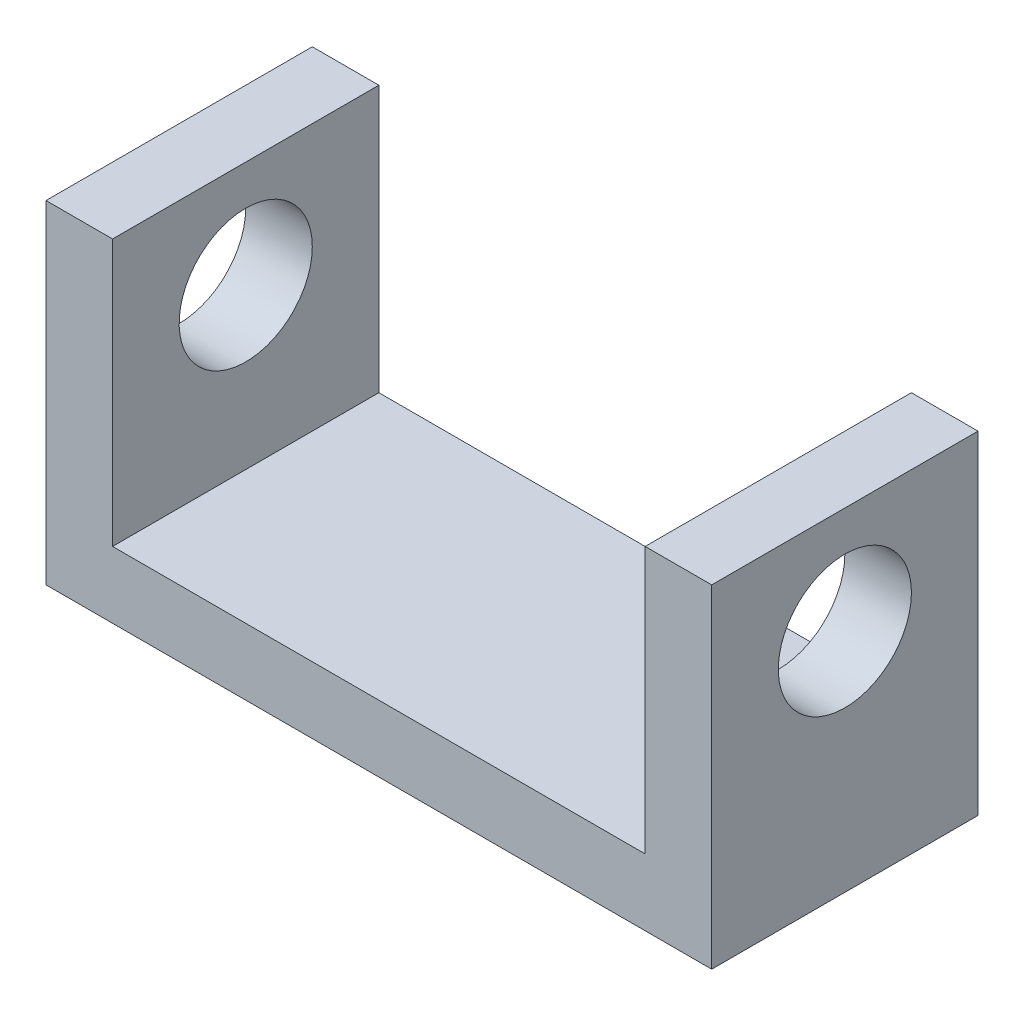
ISO-10303-21;
HEADER;
FILE_DESCRIPTION(('STEP AP214'),'2;1');
FILE_NAME('part.step','',(''),(''),'','','');
FILE_SCHEMA(('AUTOMOTIVE_DESIGN { 1 0 10303 214 1 1 1 1 }'));
ENDSEC;
DATA;
#1=APPLICATION_CONTEXT('core data for automotive mechanical design processes');
#2=APPLICATION_PROTOCOL_DEFINITION('international standard','automotive_design',2000,#1);
#3=PRODUCT_CONTEXT('',#1,'mechanical');
#4=PRODUCT('Part','Part','',(#3));
#5=PRODUCT_RELATED_PRODUCT_CATEGORY('part','',(#4));
#6=PRODUCT_DEFINITION_FORMATION('','',#4);
#7=PRODUCT_DEFINITION_CONTEXT('part definition',#1,'design');
#8=PRODUCT_DEFINITION('design','',#6,#7);
#9=PRODUCT_DEFINITION_SHAPE('','',#8);
#10=(LENGTH_UNIT() NAMED_UNIT(*) SI_UNIT(.MILLI.,.METRE.));
#11=(NAMED_UNIT(*) PLANE_ANGLE_UNIT() SI_UNIT($,.RADIAN.));
#12=(NAMED_UNIT(*) SI_UNIT($,.STERADIAN.) SOLID_ANGLE_UNIT());
#13=UNCERTAINTY_MEASURE_WITH_UNIT(LENGTH_MEASURE(1.E-05),#10,'distance_accuracy_value','');
#14=(GEOMETRIC_REPRESENTATION_CONTEXT(3) GLOBAL_UNCERTAINTY_ASSIGNED_CONTEXT((#13)) GLOBAL_UNIT_ASSIGNED_CONTEXT((#10,
#11,#12)) REPRESENTATION_CONTEXT('',''));
#15=CARTESIAN_POINT('',(0.,0.,0.));
#16=DIRECTION('',(0.,0.,1.));
#17=DIRECTION('',(1.,0.,0.));
#18=AXIS2_PLACEMENT_3D('',#15,#16,#17);
#19=CARTESIAN_POINT('',(28.575,0.,12.7));
#20=DIRECTION('',(-1.,0.,0.));
#21=DIRECTION('',(0.,0.,1.));
#22=AXIS2_PLACEMENT_3D('',#19,#20,#21);
#23=PLANE('',#22);
#24=CARTESIAN_POINT('',(28.575,7.62,6.35));
#25=DIRECTION('',(1.,0.,0.));
#26=DIRECTION('',(0.,0.,-1.));
#27=AXIS2_PLACEMENT_3D('',#24,#25,#26);
#28=CIRCLE('',#27,3.175);
#29=CARTESIAN_POINT('',(28.575,7.62,3.175));
#30=VERTEX_POINT('',#29);
#31=EDGE_CURVE('E188',#30,#30,#28,.T.);
#32=ORIENTED_EDGE('',*,*,#31,.F.);
#33=EDGE_LOOP('',(#32));
#34=FACE_BOUND('',#33,.T.);
#35=DIRECTION('',(0.,1.,0.));
#36=VECTOR('',#35,1.);
#37=CARTESIAN_POINT('',(28.575,0.,0.));
#38=LINE('',#37,#36);
#39=CARTESIAN_POINT('',(28.575,-3.175,0.));
#40=VERTEX_POINT('',#39);
#41=CARTESIAN_POINT('',(28.575,12.7,0.));
#42=VERTEX_POINT('',#41);
#43=EDGE_CURVE('E134',#40,#42,#38,.T.);
#44=ORIENTED_EDGE('',*,*,#43,.T.);
#45=DIRECTION('',(0.,0.,-1.));
#46=VECTOR('',#45,1.);
#47=CARTESIAN_POINT('',(28.575,12.7,12.7));
#48=LINE('',#47,#46);
#49=CARTESIAN_POINT('',(28.575,12.7,12.7));
#50=VERTEX_POINT('',#49);
#51=EDGE_CURVE('E11',#50,#42,#48,.T.);
#52=ORIENTED_EDGE('',*,*,#51,.F.);
#53=DIRECTION('',(0.,1.,0.));
#54=VECTOR('',#53,1.);
#55=CARTESIAN_POINT('',(28.575,0.,12.7));
#56=LINE('',#55,#54);
#57=CARTESIAN_POINT('',(28.575,-3.175,12.7));
#58=VERTEX_POINT('',#57);
#59=EDGE_CURVE('E92',#58,#50,#56,.T.);
#60=ORIENTED_EDGE('',*,*,#59,.F.);
#61=DIRECTION('',(0.,0.,-1.));
#62=VECTOR('',#61,1.);
#63=CARTESIAN_POINT('',(28.575,-3.175,12.7));
#64=LINE('',#63,#62);
#65=EDGE_CURVE('E133',#58,#40,#64,.T.);
#66=ORIENTED_EDGE('',*,*,#65,.T.);
#67=EDGE_LOOP('',(#44,#52,#60,#66));
#68=FACE_BOUND('',#67,.T.);
#69=ADVANCED_FACE('F37',(#34,#68),#23,.F.);
#70=CARTESIAN_POINT('',(25.4,12.7,12.7));
#71=DIRECTION('',(0.,1.,0.));
#72=DIRECTION('',(0.,0.,1.));
#73=AXIS2_PLACEMENT_3D('',#70,#71,#72);
#74=PLANE('',#73);
#75=DIRECTION('',(1.,0.,0.));
#76=VECTOR('',#75,1.);
#77=CARTESIAN_POINT('',(25.4,12.7,0.));
#78=LINE('',#77,#76);
#79=CARTESIAN_POINT('',(25.4,12.7,0.));
#80=VERTEX_POINT('',#79);
#81=EDGE_CURVE('E137',#80,#42,#78,.T.);
#82=ORIENTED_EDGE('',*,*,#81,.F.);
#83=DIRECTION('',(0.,0.,-1.));
#84=VECTOR('',#83,1.);
#85=CARTESIAN_POINT('',(25.4,12.7,12.7));
#86=LINE('',#85,#84);
#87=CARTESIAN_POINT('',(25.4,12.7,12.7));
#88=VERTEX_POINT('',#87);
#89=EDGE_CURVE('E45',#88,#80,#86,.T.);
#90=ORIENTED_EDGE('',*,*,#89,.F.);
#91=DIRECTION('',(1.,0.,0.));
#92=VECTOR('',#91,1.);
#93=CARTESIAN_POINT('',(25.4,12.7,12.7));
#94=LINE('',#93,#92);
#95=EDGE_CURVE('E177',#88,#50,#94,.T.);
#96=ORIENTED_EDGE('',*,*,#95,.T.);
#97=ORIENTED_EDGE('',*,*,#51,.T.);
#98=EDGE_LOOP('',(#82,#90,#96,#97));
#99=FACE_BOUND('',#98,.T.);
#100=ADVANCED_FACE('F168',(#99),#74,.T.);
#101=CARTESIAN_POINT('',(25.4,0.,12.7));
#102=DIRECTION('',(-1.,0.,0.));
#103=DIRECTION('',(0.,0.,1.));
#104=AXIS2_PLACEMENT_3D('',#101,#102,#103);
#105=PLANE('',#104);
#106=CARTESIAN_POINT('',(25.4,7.62,6.35));
#107=DIRECTION('',(-1.,0.,0.));
#108=DIRECTION('',(0.,0.,1.));
#109=AXIS2_PLACEMENT_3D('',#106,#107,#108);
#110=CIRCLE('',#109,3.175);
#111=CARTESIAN_POINT('',(25.4,7.62,9.525));
#112=VERTEX_POINT('',#111);
#113=EDGE_CURVE('E138',#112,#112,#110,.T.);
#114=ORIENTED_EDGE('',*,*,#113,.F.);
#115=EDGE_LOOP('',(#114));
#116=FACE_BOUND('',#115,.T.);
#117=DIRECTION('',(0.,1.,0.));
#118=VECTOR('',#117,1.);
#119=CARTESIAN_POINT('',(25.4,0.,0.));
#120=LINE('',#119,#118);
#121=CARTESIAN_POINT('',(25.4,0.,0.));
#122=VERTEX_POINT('',#121);
#123=EDGE_CURVE('E141',#122,#80,#120,.T.);
#124=ORIENTED_EDGE('',*,*,#123,.F.);
#125=DIRECTION('',(0.,0.,-1.));
#126=VECTOR('',#125,1.);
#127=CARTESIAN_POINT('',(25.4,0.,12.7));
#128=LINE('',#127,#126);
#129=CARTESIAN_POINT('',(25.4,0.,12.7));
#130=VERTEX_POINT('',#129);
#131=EDGE_CURVE('E158',#130,#122,#128,.T.);
#132=ORIENTED_EDGE('',*,*,#131,.F.);
#133=DIRECTION('',(0.,1.,0.));
#134=VECTOR('',#133,1.);
#135=CARTESIAN_POINT('',(25.4,0.,12.7));
#136=LINE('',#135,#134);
#137=EDGE_CURVE('E165',#130,#88,#136,.T.);
#138=ORIENTED_EDGE('',*,*,#137,.T.);
#139=ORIENTED_EDGE('',*,*,#89,.T.);
#140=EDGE_LOOP('',(#124,#132,#138,#139));
#141=FACE_BOUND('',#140,.T.);
#142=ADVANCED_FACE('F163',(#116,#141),#105,.T.);
#143=CARTESIAN_POINT('',(0.,0.,12.7));
#144=DIRECTION('',(0.,1.,0.));
#145=DIRECTION('',(0.,0.,1.));
#146=AXIS2_PLACEMENT_3D('',#143,#144,#145);
#147=PLANE('',#146);
#148=DIRECTION('',(1.,0.,0.));
#149=VECTOR('',#148,1.);
#150=CARTESIAN_POINT('',(0.,0.,0.));
#151=LINE('',#150,#149);
#152=CARTESIAN_POINT('',(0.,0.,0.));
#153=VERTEX_POINT('',#152);
#154=EDGE_CURVE('E144',#153,#122,#151,.T.);
#155=ORIENTED_EDGE('',*,*,#154,.F.);
#156=DIRECTION('',(0.,0.,-1.));
#157=VECTOR('',#156,1.);
#158=CARTESIAN_POINT('',(0.,0.,12.7));
#159=LINE('',#158,#157);
#160=CARTESIAN_POINT('',(0.,0.,12.7));
#161=VERTEX_POINT('',#160);
#162=EDGE_CURVE('E156',#161,#153,#159,.T.);
#163=ORIENTED_EDGE('',*,*,#162,.F.);
#164=DIRECTION('',(1.,0.,0.));
#165=VECTOR('',#164,1.);
#166=CARTESIAN_POINT('',(0.,0.,12.7));
#167=LINE('',#166,#165);
#168=EDGE_CURVE('E128',#161,#130,#167,.T.);
#169=ORIENTED_EDGE('',*,*,#168,.T.);
#170=ORIENTED_EDGE('',*,*,#131,.T.);
#171=EDGE_LOOP('',(#155,#163,#169,#170));
#172=FACE_BOUND('',#171,.T.);
#173=ADVANCED_FACE('F175',(#172),#147,.T.);
#174=CARTESIAN_POINT('',(0.,12.7,12.7));
#175=DIRECTION('',(1.,0.,0.));
#176=DIRECTION('',(0.,1.,0.));
#177=AXIS2_PLACEMENT_3D('',#174,#175,#176);
#178=PLANE('',#177);
#179=CARTESIAN_POINT('',(0.,7.62,6.35));
#180=DIRECTION('',(1.,0.,0.));
#181=DIRECTION('',(0.,1.,0.));
#182=AXIS2_PLACEMENT_3D('',#179,#180,#181);
#183=CIRCLE('',#182,3.175);
#184=CARTESIAN_POINT('',(0.,10.795,6.35));
#185=VERTEX_POINT('',#184);
#186=EDGE_CURVE('E184',#185,#185,#183,.T.);
#187=ORIENTED_EDGE('',*,*,#186,.F.);
#188=EDGE_LOOP('',(#187));
#189=FACE_BOUND('',#188,.T.);
#190=DIRECTION('',(0.,-1.,0.));
#191=VECTOR('',#190,1.);
#192=CARTESIAN_POINT('',(0.,12.7,0.));
#193=LINE('',#192,#191);
#194=CARTESIAN_POINT('',(0.,12.7,0.));
#195=VERTEX_POINT('',#194);
#196=EDGE_CURVE('E147',#195,#153,#193,.T.);
#197=ORIENTED_EDGE('',*,*,#196,.F.);
#198=DIRECTION('',(0.,0.,-1.));
#199=VECTOR('',#198,1.);
#200=CARTESIAN_POINT('',(0.,12.7,12.7));
#201=LINE('',#200,#199);
#202=CARTESIAN_POINT('',(0.,12.7,12.7));
#203=VERTEX_POINT('',#202);
#204=EDGE_CURVE('E116',#203,#195,#201,.T.);
#205=ORIENTED_EDGE('',*,*,#204,.F.);
#206=DIRECTION('',(0.,-1.,0.));
#207=VECTOR('',#206,1.);
#208=CARTESIAN_POINT('',(0.,12.7,12.7));
#209=LINE('',#208,#207);
#210=EDGE_CURVE('E126',#203,#161,#209,.T.);
#211=ORIENTED_EDGE('',*,*,#210,.T.);
#212=ORIENTED_EDGE('',*,*,#162,.T.);
#213=EDGE_LOOP('',(#197,#205,#211,#212));
#214=FACE_BOUND('',#213,.T.);
#215=ADVANCED_FACE('F228',(#189,#214),#178,.T.);
#216=CARTESIAN_POINT('',(-3.175,12.7,12.7));
#217=DIRECTION('',(0.,1.,0.));
#218=DIRECTION('',(0.,0.,1.));
#219=AXIS2_PLACEMENT_3D('',#216,#217,#218);
#220=PLANE('',#219);
#221=DIRECTION('',(1.,0.,0.));
#222=VECTOR('',#221,1.);
#223=CARTESIAN_POINT('',(-3.175,12.7,0.));
#224=LINE('',#223,#222);
#225=CARTESIAN_POINT('',(-3.175,12.7,0.));
#226=VERTEX_POINT('',#225);
#227=EDGE_CURVE('E115',#226,#195,#224,.T.);
#228=ORIENTED_EDGE('',*,*,#227,.F.);
#229=DIRECTION('',(0.,0.,-1.));
#230=VECTOR('',#229,1.);
#231=CARTESIAN_POINT('',(-3.175,12.7,12.7));
#232=LINE('',#231,#230);
#233=CARTESIAN_POINT('',(-3.175,12.7,12.7));
#234=VERTEX_POINT('',#233);
#235=EDGE_CURVE('E109',#234,#226,#232,.T.);
#236=ORIENTED_EDGE('',*,*,#235,.F.);
#237=DIRECTION('',(1.,0.,0.));
#238=VECTOR('',#237,1.);
#239=CARTESIAN_POINT('',(-3.175,12.7,12.7));
#240=LINE('',#239,#238);
#241=EDGE_CURVE('E113',#234,#203,#240,.T.);
#242=ORIENTED_EDGE('',*,*,#241,.T.);
#243=ORIENTED_EDGE('',*,*,#204,.T.);
#244=EDGE_LOOP('',(#228,#236,#242,#243));
#245=FACE_BOUND('',#244,.T.);
#246=ADVANCED_FACE('F111',(#245),#220,.T.);
#247=CARTESIAN_POINT('',(-3.175,12.7,12.7));
#248=DIRECTION('',(1.,0.,0.));
#249=DIRECTION('',(0.,1.,0.));
#250=AXIS2_PLACEMENT_3D('',#247,#248,#249);
#251=PLANE('',#250);
#252=CARTESIAN_POINT('',(-3.175,7.62,6.35));
#253=DIRECTION('',(1.,0.,0.));
#254=DIRECTION('',(0.,0.,-1.));
#255=AXIS2_PLACEMENT_3D('',#252,#253,#254);
#256=CIRCLE('',#255,3.175);
#257=CARTESIAN_POINT('',(-3.175,7.62,3.175));
#258=VERTEX_POINT('',#257);
#259=EDGE_CURVE('E187',#258,#258,#256,.T.);
#260=ORIENTED_EDGE('',*,*,#259,.T.);
#261=EDGE_LOOP('',(#260));
#262=FACE_BOUND('',#261,.T.);
#263=DIRECTION('',(0.,-1.,0.));
#264=VECTOR('',#263,1.);
#265=CARTESIAN_POINT('',(-3.175,12.7,0.));
#266=LINE('',#265,#264);
#267=CARTESIAN_POINT('',(-3.175,-3.175,0.));
#268=VERTEX_POINT('',#267);
#269=EDGE_CURVE('E80',#226,#268,#266,.T.);
#270=ORIENTED_EDGE('',*,*,#269,.T.);
#271=DIRECTION('',(0.,0.,-1.));
#272=VECTOR('',#271,1.);
#273=CARTESIAN_POINT('',(-3.175,-3.175,12.7));
#274=LINE('',#273,#272);
#275=CARTESIAN_POINT('',(-3.175,-3.175,12.7));
#276=VERTEX_POINT('',#275);
#277=EDGE_CURVE('E117',#276,#268,#274,.T.);
#278=ORIENTED_EDGE('',*,*,#277,.F.);
#279=DIRECTION('',(0.,-1.,0.));
#280=VECTOR('',#279,1.);
#281=CARTESIAN_POINT('',(-3.175,12.7,12.7));
#282=LINE('',#281,#280);
#283=EDGE_CURVE('E119',#234,#276,#282,.T.);
#284=ORIENTED_EDGE('',*,*,#283,.F.);
#285=ORIENTED_EDGE('',*,*,#235,.T.);
#286=EDGE_LOOP('',(#270,#278,#284,#285));
#287=FACE_BOUND('',#286,.T.);
#288=ADVANCED_FACE('F120',(#262,#287),#251,.F.);
#289=CARTESIAN_POINT('',(0.,-3.175,12.7));
#290=DIRECTION('',(0.,1.,0.));
#291=DIRECTION('',(0.,0.,1.));
#292=AXIS2_PLACEMENT_3D('',#289,#290,#291);
#293=PLANE('',#292);
#294=DIRECTION('',(1.,0.,0.));
#295=VECTOR('',#294,1.);
#296=CARTESIAN_POINT('',(0.,-3.175,0.));
#297=LINE('',#296,#295);
#298=EDGE_CURVE('E86',#268,#40,#297,.T.);
#299=ORIENTED_EDGE('',*,*,#298,.T.);
#300=ORIENTED_EDGE('',*,*,#65,.F.);
#301=DIRECTION('',(1.,0.,0.));
#302=VECTOR('',#301,1.);
#303=CARTESIAN_POINT('',(0.,-3.175,12.7));
#304=LINE('',#303,#302);
#305=EDGE_CURVE('E53',#276,#58,#304,.T.);
#306=ORIENTED_EDGE('',*,*,#305,.F.);
#307=ORIENTED_EDGE('',*,*,#277,.T.);
#308=EDGE_LOOP('',(#299,#300,#306,#307));
#309=FACE_BOUND('',#308,.T.);
#310=ADVANCED_FACE('F216',(#309),#293,.F.);
#311=CARTESIAN_POINT('',(0.,0.,12.7));
#312=DIRECTION('',(0.,0.,-1.));
#313=DIRECTION('',(-1.,0.,0.));
#314=AXIS2_PLACEMENT_3D('',#311,#312,#313);
#315=PLANE('',#314);
#316=ORIENTED_EDGE('',*,*,#59,.T.);
#317=ORIENTED_EDGE('',*,*,#95,.F.);
#318=ORIENTED_EDGE('',*,*,#137,.F.);
#319=ORIENTED_EDGE('',*,*,#168,.F.);
#320=ORIENTED_EDGE('',*,*,#210,.F.);
#321=ORIENTED_EDGE('',*,*,#241,.F.);
#322=ORIENTED_EDGE('',*,*,#283,.T.);
#323=ORIENTED_EDGE('',*,*,#305,.T.);
#324=EDGE_LOOP('',(#316,#317,#318,#319,#320,#321,#322,#323));
#325=FACE_BOUND('',#324,.T.);
#326=ADVANCED_FACE('F123',(#325),#315,.F.);
#327=CARTESIAN_POINT('',(0.,0.,0.));
#328=DIRECTION('',(0.,0.,-1.));
#329=DIRECTION('',(-1.,0.,0.));
#330=AXIS2_PLACEMENT_3D('',#327,#328,#329);
#331=PLANE('',#330);
#332=ORIENTED_EDGE('',*,*,#43,.F.);
#333=ORIENTED_EDGE('',*,*,#298,.F.);
#334=ORIENTED_EDGE('',*,*,#269,.F.);
#335=ORIENTED_EDGE('',*,*,#227,.T.);
#336=ORIENTED_EDGE('',*,*,#196,.T.);
#337=ORIENTED_EDGE('',*,*,#154,.T.);
#338=ORIENTED_EDGE('',*,*,#123,.T.);
#339=ORIENTED_EDGE('',*,*,#81,.T.);
#340=EDGE_LOOP('',(#332,#333,#334,#335,#336,#337,#338,#339));
#341=FACE_BOUND('',#340,.T.);
#342=ADVANCED_FACE('F171',(#341),#331,.T.);
#343=CARTESIAN_POINT('',(-3.175,7.62,6.35));
#344=DIRECTION('',(1.,0.,0.));
#345=DIRECTION('',(0.,0.,-1.));
#346=AXIS2_PLACEMENT_3D('',#343,#344,#345);
#347=CYLINDRICAL_SURFACE('',#346,3.175);
#348=ORIENTED_EDGE('',*,*,#186,.T.);
#349=EDGE_LOOP('',(#348));
#350=FACE_BOUND('',#349,.T.);
#351=ORIENTED_EDGE('',*,*,#259,.F.);
#352=EDGE_LOOP('',(#351));
#353=FACE_BOUND('',#352,.T.);
#354=ADVANCED_FACE('F195',(#350,#353),#347,.F.);
#355=ORIENTED_EDGE('',*,*,#113,.T.);
#356=EDGE_LOOP('',(#355));
#357=FACE_BOUND('',#356,.T.);
#358=ORIENTED_EDGE('',*,*,#31,.T.);
#359=EDGE_LOOP('',(#358));
#360=FACE_BOUND('',#359,.T.);
#361=ADVANCED_FACE('F197',(#357,#360),#347,.F.);
#362=CLOSED_SHELL('',(#69,#100,#142,#173,#215,#246,#288,#310,#326,#342,#354,#361));
#363=MANIFOLD_SOLID_BREP('B2',#362);
#364=ADVANCED_BREP_SHAPE_REPRESENTATION('',(#18,#363),#14);
#365=SHAPE_DEFINITION_REPRESENTATION(#9,#364);
ENDSEC;
END-ISO-10303-21;
